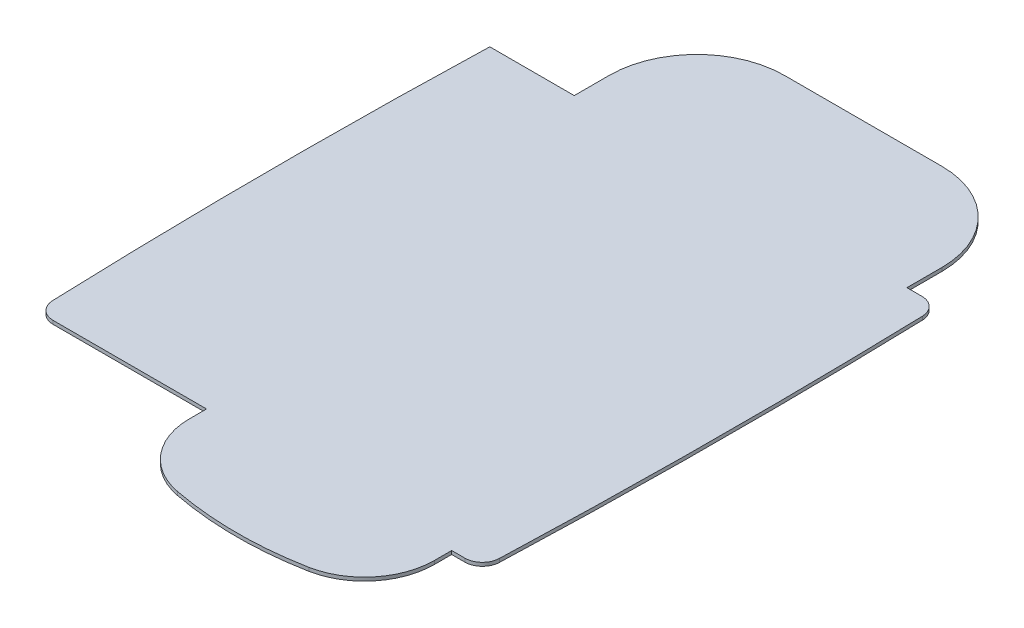
ISO-10303-21;
HEADER;
FILE_DESCRIPTION(('STEP AP214'),'2;1');
FILE_NAME('part.step','',(''),(''),'','','');
FILE_SCHEMA(('AUTOMOTIVE_DESIGN { 1 0 10303 214 1 1 1 1 }'));
ENDSEC;
DATA;
#1=APPLICATION_CONTEXT('core data for automotive mechanical design processes');
#2=APPLICATION_PROTOCOL_DEFINITION('international standard','automotive_design',2000,#1);
#3=PRODUCT_CONTEXT('',#1,'mechanical');
#4=PRODUCT('Part','Part','',(#3));
#5=PRODUCT_RELATED_PRODUCT_CATEGORY('part','',(#4));
#6=PRODUCT_DEFINITION_FORMATION('','',#4);
#7=PRODUCT_DEFINITION_CONTEXT('part definition',#1,'design');
#8=PRODUCT_DEFINITION('design','',#6,#7);
#9=PRODUCT_DEFINITION_SHAPE('','',#8);
#10=(LENGTH_UNIT() NAMED_UNIT(*) SI_UNIT(.MILLI.,.METRE.));
#11=(NAMED_UNIT(*) PLANE_ANGLE_UNIT() SI_UNIT($,.RADIAN.));
#12=(NAMED_UNIT(*) SI_UNIT($,.STERADIAN.) SOLID_ANGLE_UNIT());
#13=UNCERTAINTY_MEASURE_WITH_UNIT(LENGTH_MEASURE(1.E-05),#10,'distance_accuracy_value','');
#14=(GEOMETRIC_REPRESENTATION_CONTEXT(3) GLOBAL_UNCERTAINTY_ASSIGNED_CONTEXT((#13)) GLOBAL_UNIT_ASSIGNED_CONTEXT((#10,
#11,#12)) REPRESENTATION_CONTEXT('',''));
#15=CARTESIAN_POINT('',(0.,0.,0.));
#16=DIRECTION('',(0.,0.,1.));
#17=DIRECTION('',(1.,0.,0.));
#18=AXIS2_PLACEMENT_3D('',#15,#16,#17);
#19=CARTESIAN_POINT('',(0.,0.5,-92.5));
#20=DIRECTION('',(0.,0.,-1.));
#21=DIRECTION('',(-1.,0.,0.));
#22=AXIS2_PLACEMENT_3D('',#19,#20,#21);
#23=PLANE('',#22);
#24=DIRECTION('',(1.,0.,0.));
#25=VECTOR('',#24,1.);
#26=CARTESIAN_POINT('',(0.,-0.5,-92.5));
#27=LINE('',#26,#25);
#28=CARTESIAN_POINT('',(-15.,-0.5,-92.5));
#29=VERTEX_POINT('',#28);
#30=CARTESIAN_POINT('',(30.,-0.5,-92.5));
#31=VERTEX_POINT('',#30);
#32=EDGE_CURVE('E196',#29,#31,#27,.T.);
#33=ORIENTED_EDGE('',*,*,#32,.F.);
#34=DIRECTION('',(0.,1.,0.));
#35=VECTOR('',#34,1.);
#36=CARTESIAN_POINT('',(-15.,-0.5,-92.5));
#37=LINE('',#36,#35);
#38=CARTESIAN_POINT('',(-15.,0.5,-92.5));
#39=VERTEX_POINT('',#38);
#40=EDGE_CURVE('E179',#29,#39,#37,.T.);
#41=ORIENTED_EDGE('',*,*,#40,.T.);
#42=DIRECTION('',(1.,0.,0.));
#43=VECTOR('',#42,1.);
#44=CARTESIAN_POINT('',(0.,0.5,-92.5));
#45=LINE('',#44,#43);
#46=CARTESIAN_POINT('',(30.,0.5,-92.5));
#47=VERTEX_POINT('',#46);
#48=EDGE_CURVE('E331',#39,#47,#45,.T.);
#49=ORIENTED_EDGE('',*,*,#48,.T.);
#50=DIRECTION('',(0.,1.,0.));
#51=VECTOR('',#50,1.);
#52=CARTESIAN_POINT('',(30.,-0.5,-92.5));
#53=LINE('',#52,#51);
#54=EDGE_CURVE('E201',#31,#47,#53,.T.);
#55=ORIENTED_EDGE('',*,*,#54,.F.);
#56=EDGE_LOOP('',(#33,#41,#49,#55));
#57=FACE_BOUND('',#56,.T.);
#58=ADVANCED_FACE('F48',(#57),#23,.T.);
#59=CARTESIAN_POINT('',(0.,0.5,0.));
#60=DIRECTION('',(0.,1.,0.));
#61=DIRECTION('',(0.,0.,1.));
#62=AXIS2_PLACEMENT_3D('',#59,#60,#61);
#63=PLANE('',#62);
#64=DIRECTION('',(0.,0.,-1.));
#65=VECTOR('',#64,1.);
#66=CARTESIAN_POINT('',(-15.,0.5,72.5));
#67=LINE('',#66,#65);
#68=CARTESIAN_POINT('',(-15.,0.5,77.4061982515326));
#69=VERTEX_POINT('',#68);
#70=CARTESIAN_POINT('',(-15.,0.5,72.5));
#71=VERTEX_POINT('',#70);
#72=EDGE_CURVE('E281',#69,#71,#67,.T.);
#73=ORIENTED_EDGE('',*,*,#72,.F.);
#74=CARTESIAN_POINT('',(5.00000000000002,0.5,77.4061982515326));
#75=DIRECTION('',(0.,1.,0.));
#76=DIRECTION('',(0.,0.,1.));
#77=AXIS2_PLACEMENT_3D('',#74,#75,#76);
#78=CIRCLE('',#77,20.);
#79=CARTESIAN_POINT('',(1.25000000000002,0.5,97.0514903084097));
#80=VERTEX_POINT('',#79);
#81=EDGE_CURVE('E249',#69,#80,#78,.T.);
#82=ORIENTED_EDGE('',*,*,#81,.T.);
#83=CARTESIAN_POINT('',(20.,0.5,-1.17496997597598));
#84=DIRECTION('',(0.,1.,0.));
#85=DIRECTION('',(0.,0.,1.));
#86=AXIS2_PLACEMENT_3D('',#83,#84,#85);
#87=CIRCLE('',#86,100.);
#88=CARTESIAN_POINT('',(38.75,0.5,97.0514903084097));
#89=VERTEX_POINT('',#88);
#90=EDGE_CURVE('E279',#80,#89,#87,.T.);
#91=ORIENTED_EDGE('',*,*,#90,.T.);
#92=CARTESIAN_POINT('',(35.,0.5,77.4061982515326));
#93=DIRECTION('',(0.,1.,0.));
#94=DIRECTION('',(0.,0.,1.));
#95=AXIS2_PLACEMENT_3D('',#92,#93,#94);
#96=CIRCLE('',#95,20.);
#97=CARTESIAN_POINT('',(55.,0.5,77.4061982515326));
#98=VERTEX_POINT('',#97);
#99=EDGE_CURVE('E247',#89,#98,#96,.T.);
#100=ORIENTED_EDGE('',*,*,#99,.T.);
#101=DIRECTION('',(0.,0.,1.));
#102=VECTOR('',#101,1.);
#103=CARTESIAN_POINT('',(55.,0.5,72.5));
#104=LINE('',#103,#102);
#105=CARTESIAN_POINT('',(55.,0.5,72.5));
#106=VERTEX_POINT('',#105);
#107=EDGE_CURVE('E285',#106,#98,#104,.T.);
#108=ORIENTED_EDGE('',*,*,#107,.F.);
#109=DIRECTION('',(-1.,0.,0.));
#110=VECTOR('',#109,1.);
#111=CARTESIAN_POINT('',(55.,0.5,72.5));
#112=LINE('',#111,#110);
#113=CARTESIAN_POINT('',(58.7764057886327,0.5,72.5));
#114=VERTEX_POINT('',#113);
#115=EDGE_CURVE('E287',#114,#106,#112,.T.);
#116=ORIENTED_EDGE('',*,*,#115,.F.);
#117=CARTESIAN_POINT('',(58.7764057886327,0.5,67.5));
#118=DIRECTION('',(0.,1.,0.));
#119=DIRECTION('',(0.,0.,1.));
#120=AXIS2_PLACEMENT_3D('',#117,#118,#119);
#121=CIRCLE('',#120,5.);
#122=CARTESIAN_POINT('',(63.7730594606828,0.5,67.6828991022093));
#123=VERTEX_POINT('',#122);
#124=EDGE_CURVE('E222',#114,#123,#121,.T.);
#125=ORIENTED_EDGE('',*,*,#124,.T.);
#126=CARTESIAN_POINT('',(0.,0.5,0.));
#127=DIRECTION('',(0.,1.,0.));
#128=DIRECTION('',(0.,0.,1.));
#129=AXIS2_PLACEMENT_3D('',#126,#127,#128);
#130=ELLIPSE('',#129,350.,65.);
#131=CARTESIAN_POINT('',(64.2606055592189,0.5,-52.6412109634021));
#132=VERTEX_POINT('',#131);
#133=EDGE_CURVE('E206',#123,#132,#130,.T.);
#134=ORIENTED_EDGE('',*,*,#133,.T.);
#135=CARTESIAN_POINT('',(59.262600010621,0.5,-52.5));
#136=DIRECTION('',(0.,1.,0.));
#137=DIRECTION('',(0.,0.,1.));
#138=AXIS2_PLACEMENT_3D('',#135,#136,#137);
#139=CIRCLE('',#138,5.);
#140=CARTESIAN_POINT('',(59.262600010621,0.5,-57.5));
#141=VERTEX_POINT('',#140);
#142=EDGE_CURVE('E220',#132,#141,#139,.T.);
#143=ORIENTED_EDGE('',*,*,#142,.T.);
#144=DIRECTION('',(1.,0.,0.));
#145=VECTOR('',#144,1.);
#146=CARTESIAN_POINT('',(55.,0.5,-57.5));
#147=LINE('',#146,#145);
#148=CARTESIAN_POINT('',(55.,0.5,-57.5));
#149=VERTEX_POINT('',#148);
#150=EDGE_CURVE('E309',#149,#141,#147,.T.);
#151=ORIENTED_EDGE('',*,*,#150,.F.);
#152=DIRECTION('',(0.,0.,1.));
#153=VECTOR('',#152,1.);
#154=CARTESIAN_POINT('',(55.,0.5,-92.5));
#155=LINE('',#154,#153);
#156=CARTESIAN_POINT('',(55.,0.5,-67.5));
#157=VERTEX_POINT('',#156);
#158=EDGE_CURVE('E305',#157,#149,#155,.T.);
#159=ORIENTED_EDGE('',*,*,#158,.F.);
#160=CARTESIAN_POINT('',(30.,0.5,-67.5));
#161=DIRECTION('',(0.,1.,0.));
#162=DIRECTION('',(0.,0.,1.));
#163=AXIS2_PLACEMENT_3D('',#160,#161,#162);
#164=CIRCLE('',#163,25.);
#165=EDGE_CURVE('E389',#157,#47,#164,.T.);
#166=ORIENTED_EDGE('',*,*,#165,.T.);
#167=ORIENTED_EDGE('',*,*,#48,.F.);
#168=CARTESIAN_POINT('',(-15.,0.5,-67.5));
#169=DIRECTION('',(0.,1.,0.));
#170=DIRECTION('',(0.,0.,1.));
#171=AXIS2_PLACEMENT_3D('',#168,#169,#170);
#172=CIRCLE('',#171,25.);
#173=CARTESIAN_POINT('',(-40.,0.5,-67.5));
#174=VERTEX_POINT('',#173);
#175=EDGE_CURVE('E185',#39,#174,#172,.T.);
#176=ORIENTED_EDGE('',*,*,#175,.T.);
#177=DIRECTION('',(0.,0.,-1.));
#178=VECTOR('',#177,1.);
#179=CARTESIAN_POINT('',(-40.,0.5,-92.5));
#180=LINE('',#179,#178);
#181=CARTESIAN_POINT('',(-40.,0.5,-57.5));
#182=VERTEX_POINT('',#181);
#183=EDGE_CURVE('E321',#182,#174,#180,.T.);
#184=ORIENTED_EDGE('',*,*,#183,.F.);
#185=DIRECTION('',(1.,0.,0.));
#186=VECTOR('',#185,1.);
#187=CARTESIAN_POINT('',(-65.,0.5,-57.5));
#188=LINE('',#187,#186);
#189=CARTESIAN_POINT('',(-64.1168317389818,0.5,-57.5));
#190=VERTEX_POINT('',#189);
#191=EDGE_CURVE('E318',#190,#182,#188,.T.);
#192=ORIENTED_EDGE('',*,*,#191,.F.);
#193=CARTESIAN_POINT('',(-63.7730594606828,0.5,67.6828991022094));
#194=VERTEX_POINT('',#193);
#195=EDGE_CURVE('E215',#190,#194,#130,.T.);
#196=ORIENTED_EDGE('',*,*,#195,.T.);
#197=CARTESIAN_POINT('',(-58.7764057886327,0.5,67.5000000000001));
#198=DIRECTION('',(0.,1.,0.));
#199=DIRECTION('',(0.,0.,1.));
#200=AXIS2_PLACEMENT_3D('',#197,#198,#199);
#201=CIRCLE('',#200,5.);
#202=CARTESIAN_POINT('',(-58.7764057886327,0.5,72.5));
#203=VERTEX_POINT('',#202);
#204=EDGE_CURVE('E224',#194,#203,#201,.T.);
#205=ORIENTED_EDGE('',*,*,#204,.T.);
#206=DIRECTION('',(-1.,0.,0.));
#207=VECTOR('',#206,1.);
#208=CARTESIAN_POINT('',(-65.,0.5,72.5));
#209=LINE('',#208,#207);
#210=EDGE_CURVE('E272',#71,#203,#209,.T.);
#211=ORIENTED_EDGE('',*,*,#210,.F.);
#212=EDGE_LOOP('',(#73,#82,#91,#100,#108,#116,#125,#134,#143,#151,#159,#166,#167,#176,#184,#192,
#196,#205,#211));
#213=FACE_BOUND('',#212,.T.);
#214=ADVANCED_FACE('F278',(#213),#63,.T.);
#215=CARTESIAN_POINT('',(0.,-0.5,0.));
#216=DIRECTION('',(0.,1.,0.));
#217=DIRECTION('',(0.,0.,1.));
#218=AXIS2_PLACEMENT_3D('',#215,#216,#217);
#219=PLANE('',#218);
#220=CARTESIAN_POINT('',(20.,-0.5,-1.17496997597598));
#221=DIRECTION('',(0.,1.,0.));
#222=DIRECTION('',(0.,0.,1.));
#223=AXIS2_PLACEMENT_3D('',#220,#221,#222);
#224=CIRCLE('',#223,100.);
#225=CARTESIAN_POINT('',(1.25000000000002,-0.5,97.0514903084097));
#226=VERTEX_POINT('',#225);
#227=CARTESIAN_POINT('',(38.75,-0.5,97.0514903084097));
#228=VERTEX_POINT('',#227);
#229=EDGE_CURVE('E261',#226,#228,#224,.T.);
#230=ORIENTED_EDGE('',*,*,#229,.F.);
#231=CARTESIAN_POINT('',(5.00000000000002,-0.5,77.4061982515326));
#232=DIRECTION('',(0.,1.,0.));
#233=DIRECTION('',(0.,0.,1.));
#234=AXIS2_PLACEMENT_3D('',#231,#232,#233);
#235=CIRCLE('',#234,20.);
#236=CARTESIAN_POINT('',(-15.,-0.5,77.4061982515326));
#237=VERTEX_POINT('',#236);
#238=EDGE_CURVE('E56',#226,#237,#235,.F.);
#239=ORIENTED_EDGE('',*,*,#238,.T.);
#240=DIRECTION('',(0.,0.,-1.));
#241=VECTOR('',#240,1.);
#242=CARTESIAN_POINT('',(-15.,-0.5,72.5));
#243=LINE('',#242,#241);
#244=CARTESIAN_POINT('',(-15.,-0.5,72.5));
#245=VERTEX_POINT('',#244);
#246=EDGE_CURVE('E259',#237,#245,#243,.T.);
#247=ORIENTED_EDGE('',*,*,#246,.T.);
#248=DIRECTION('',(-1.,0.,0.));
#249=VECTOR('',#248,1.);
#250=CARTESIAN_POINT('',(-65.,-0.5,72.5));
#251=LINE('',#250,#249);
#252=CARTESIAN_POINT('',(-58.7764057886327,-0.5,72.5));
#253=VERTEX_POINT('',#252);
#254=EDGE_CURVE('E271',#245,#253,#251,.T.);
#255=ORIENTED_EDGE('',*,*,#254,.T.);
#256=CARTESIAN_POINT('',(-58.7764057886327,-0.5,67.5000000000001));
#257=DIRECTION('',(0.,1.,0.));
#258=DIRECTION('',(0.,0.,1.));
#259=AXIS2_PLACEMENT_3D('',#256,#257,#258);
#260=CIRCLE('',#259,5.);
#261=CARTESIAN_POINT('',(-63.7730594606828,-0.5,67.6828991022094));
#262=VERTEX_POINT('',#261);
#263=EDGE_CURVE('E232',#253,#262,#260,.F.);
#264=ORIENTED_EDGE('',*,*,#263,.T.);
#265=CARTESIAN_POINT('',(0.,-0.5,0.));
#266=DIRECTION('',(0.,1.,0.));
#267=DIRECTION('',(0.,0.,1.));
#268=AXIS2_PLACEMENT_3D('',#265,#266,#267);
#269=ELLIPSE('',#268,350.,65.);
#270=CARTESIAN_POINT('',(-64.1168317389818,-0.5,-57.5));
#271=VERTEX_POINT('',#270);
#272=EDGE_CURVE('E202',#271,#262,#269,.T.);
#273=ORIENTED_EDGE('',*,*,#272,.F.);
#274=DIRECTION('',(1.,0.,0.));
#275=VECTOR('',#274,1.);
#276=CARTESIAN_POINT('',(0.,-0.5,-57.5));
#277=LINE('',#276,#275);
#278=CARTESIAN_POINT('',(-40.,-0.5,-57.5));
#279=VERTEX_POINT('',#278);
#280=EDGE_CURVE('E212',#271,#279,#277,.T.);
#281=ORIENTED_EDGE('',*,*,#280,.T.);
#282=DIRECTION('',(0.,0.,-1.));
#283=VECTOR('',#282,1.);
#284=CARTESIAN_POINT('',(-40.,-0.5,-92.5));
#285=LINE('',#284,#283);
#286=CARTESIAN_POINT('',(-40.,-0.5,-67.5));
#287=VERTEX_POINT('',#286);
#288=EDGE_CURVE('E198',#279,#287,#285,.T.);
#289=ORIENTED_EDGE('',*,*,#288,.T.);
#290=CARTESIAN_POINT('',(-15.,-0.5,-67.5));
#291=DIRECTION('',(0.,1.,0.));
#292=DIRECTION('',(0.,0.,1.));
#293=AXIS2_PLACEMENT_3D('',#290,#291,#292);
#294=CIRCLE('',#293,25.);
#295=EDGE_CURVE('E182',#29,#287,#294,.T.);
#296=ORIENTED_EDGE('',*,*,#295,.F.);
#297=ORIENTED_EDGE('',*,*,#32,.T.);
#298=CARTESIAN_POINT('',(30.,-0.5,-67.5));
#299=DIRECTION('',(0.,1.,0.));
#300=DIRECTION('',(0.,0.,1.));
#301=AXIS2_PLACEMENT_3D('',#298,#299,#300);
#302=CIRCLE('',#301,25.);
#303=CARTESIAN_POINT('',(55.,-0.5,-67.5));
#304=VERTEX_POINT('',#303);
#305=EDGE_CURVE('E391',#304,#31,#302,.T.);
#306=ORIENTED_EDGE('',*,*,#305,.F.);
#307=DIRECTION('',(0.,0.,1.));
#308=VECTOR('',#307,1.);
#309=CARTESIAN_POINT('',(55.,-0.5,-92.5));
#310=LINE('',#309,#308);
#311=CARTESIAN_POINT('',(55.,-0.5,-57.5));
#312=VERTEX_POINT('',#311);
#313=EDGE_CURVE('E306',#304,#312,#310,.T.);
#314=ORIENTED_EDGE('',*,*,#313,.T.);
#315=DIRECTION('',(1.,0.,0.));
#316=VECTOR('',#315,1.);
#317=CARTESIAN_POINT('',(55.,-0.5,-57.5));
#318=LINE('',#317,#316);
#319=CARTESIAN_POINT('',(59.262600010621,-0.5,-57.5));
#320=VERTEX_POINT('',#319);
#321=EDGE_CURVE('E308',#312,#320,#318,.T.);
#322=ORIENTED_EDGE('',*,*,#321,.T.);
#323=CARTESIAN_POINT('',(59.262600010621,-0.5,-52.5));
#324=DIRECTION('',(0.,1.,0.));
#325=DIRECTION('',(0.,0.,1.));
#326=AXIS2_PLACEMENT_3D('',#323,#324,#325);
#327=CIRCLE('',#326,5.);
#328=CARTESIAN_POINT('',(64.2606055592189,-0.5,-52.6412109634021));
#329=VERTEX_POINT('',#328);
#330=EDGE_CURVE('E228',#320,#329,#327,.F.);
#331=ORIENTED_EDGE('',*,*,#330,.T.);
#332=CARTESIAN_POINT('',(63.7730594606828,-0.5,67.6828991022093));
#333=VERTEX_POINT('',#332);
#334=EDGE_CURVE('E203',#333,#329,#269,.T.);
#335=ORIENTED_EDGE('',*,*,#334,.F.);
#336=CARTESIAN_POINT('',(58.7764057886327,-0.5,67.5));
#337=DIRECTION('',(0.,1.,0.));
#338=DIRECTION('',(0.,0.,1.));
#339=AXIS2_PLACEMENT_3D('',#336,#337,#338);
#340=CIRCLE('',#339,5.);
#341=CARTESIAN_POINT('',(58.7764057886327,-0.5,72.5));
#342=VERTEX_POINT('',#341);
#343=EDGE_CURVE('E230',#333,#342,#340,.F.);
#344=ORIENTED_EDGE('',*,*,#343,.T.);
#345=DIRECTION('',(-1.,0.,0.));
#346=VECTOR('',#345,1.);
#347=CARTESIAN_POINT('',(0.,-0.5,72.5));
#348=LINE('',#347,#346);
#349=CARTESIAN_POINT('',(55.,-0.5,72.5));
#350=VERTEX_POINT('',#349);
#351=EDGE_CURVE('E214',#342,#350,#348,.T.);
#352=ORIENTED_EDGE('',*,*,#351,.T.);
#353=DIRECTION('',(0.,0.,1.));
#354=VECTOR('',#353,1.);
#355=CARTESIAN_POINT('',(55.,-0.5,72.5));
#356=LINE('',#355,#354);
#357=CARTESIAN_POINT('',(55.,-0.5,77.4061982515326));
#358=VERTEX_POINT('',#357);
#359=EDGE_CURVE('E294',#350,#358,#356,.T.);
#360=ORIENTED_EDGE('',*,*,#359,.T.);
#361=CARTESIAN_POINT('',(35.,-0.5,77.4061982515326));
#362=DIRECTION('',(0.,1.,0.));
#363=DIRECTION('',(0.,0.,1.));
#364=AXIS2_PLACEMENT_3D('',#361,#362,#363);
#365=CIRCLE('',#364,20.);
#366=EDGE_CURVE('E68',#358,#228,#365,.F.);
#367=ORIENTED_EDGE('',*,*,#366,.T.);
#368=EDGE_LOOP('',(#230,#239,#247,#255,#264,#273,#281,#289,#296,#297,#306,#314,#322,#331,#335,
#344,#352,#360,#367));
#369=FACE_BOUND('',#368,.T.);
#370=ADVANCED_FACE('F194',(#369),#219,.F.);
#371=CARTESIAN_POINT('',(-40.,-0.5,-92.5));
#372=DIRECTION('',(1.,0.,0.));
#373=DIRECTION('',(0.,0.,-1.));
#374=AXIS2_PLACEMENT_3D('',#371,#372,#373);
#375=PLANE('',#374);
#376=DIRECTION('',(0.,1.,0.));
#377=VECTOR('',#376,1.);
#378=CARTESIAN_POINT('',(-40.,-0.5,-67.5));
#379=LINE('',#378,#377);
#380=EDGE_CURVE('E190',#287,#174,#379,.T.);
#381=ORIENTED_EDGE('',*,*,#380,.F.);
#382=ORIENTED_EDGE('',*,*,#288,.F.);
#383=DIRECTION('',(0.,1.,0.));
#384=VECTOR('',#383,1.);
#385=CARTESIAN_POINT('',(-40.,-0.5,-57.5));
#386=LINE('',#385,#384);
#387=EDGE_CURVE('E320',#279,#182,#386,.T.);
#388=ORIENTED_EDGE('',*,*,#387,.T.);
#389=ORIENTED_EDGE('',*,*,#183,.T.);
#390=EDGE_LOOP('',(#381,#382,#388,#389));
#391=FACE_BOUND('',#390,.T.);
#392=ADVANCED_FACE('F406',(#391),#375,.F.);
#393=DIRECTION('',(0.,-1.,0.));
#394=VECTOR('',#393,1.);
#395=SURFACE_OF_LINEAR_EXTRUSION('',#130,#394);
#396=ORIENTED_EDGE('',*,*,#133,.F.);
#397=DIRECTION('',(0.,-1.,0.));
#398=VECTOR('',#397,1.);
#399=CARTESIAN_POINT('',(63.7730594606828,0.5,67.6828991022093));
#400=LINE('',#399,#398);
#401=EDGE_CURVE('E237',#123,#333,#400,.T.);
#402=ORIENTED_EDGE('',*,*,#401,.T.);
#403=ORIENTED_EDGE('',*,*,#334,.T.);
#404=DIRECTION('',(0.,-1.,0.));
#405=VECTOR('',#404,1.);
#406=CARTESIAN_POINT('',(64.2606055592189,-0.5,-52.6412109634021));
#407=LINE('',#406,#405);
#408=EDGE_CURVE('E234',#329,#132,#407,.F.);
#409=ORIENTED_EDGE('',*,*,#408,.T.);
#410=EDGE_LOOP('',(#396,#402,#403,#409));
#411=FACE_BOUND('',#410,.T.);
#412=ADVANCED_FACE('F338',(#411),#395,.F.);
#413=ORIENTED_EDGE('',*,*,#272,.T.);
#414=DIRECTION('',(0.,-1.,0.));
#415=VECTOR('',#414,1.);
#416=CARTESIAN_POINT('',(-63.7730594606828,-0.5,67.6828991022094));
#417=LINE('',#416,#415);
#418=EDGE_CURVE('E217',#262,#194,#417,.F.);
#419=ORIENTED_EDGE('',*,*,#418,.T.);
#420=ORIENTED_EDGE('',*,*,#195,.F.);
#421=DIRECTION('',(0.,-1.,0.));
#422=VECTOR('',#421,1.);
#423=CARTESIAN_POINT('',(-64.1168317389817,0.5,-57.5));
#424=LINE('',#423,#422);
#425=EDGE_CURVE('E209',#190,#271,#424,.T.);
#426=ORIENTED_EDGE('',*,*,#425,.T.);
#427=EDGE_LOOP('',(#413,#419,#420,#426));
#428=FACE_BOUND('',#427,.T.);
#429=ADVANCED_FACE('F333',(#428),#395,.F.);
#430=CARTESIAN_POINT('',(-65.,-0.5,-57.5));
#431=DIRECTION('',(0.,0.,1.));
#432=DIRECTION('',(1.,0.,0.));
#433=AXIS2_PLACEMENT_3D('',#430,#431,#432);
#434=PLANE('',#433);
#435=ORIENTED_EDGE('',*,*,#191,.T.);
#436=ORIENTED_EDGE('',*,*,#387,.F.);
#437=ORIENTED_EDGE('',*,*,#280,.F.);
#438=ORIENTED_EDGE('',*,*,#425,.F.);
#439=EDGE_LOOP('',(#435,#436,#437,#438));
#440=FACE_BOUND('',#439,.T.);
#441=ADVANCED_FACE('F337',(#440),#434,.F.);
#442=CARTESIAN_POINT('',(55.,-0.5,-57.5));
#443=DIRECTION('',(0.,0.,1.));
#444=DIRECTION('',(1.,0.,0.));
#445=AXIS2_PLACEMENT_3D('',#442,#443,#444);
#446=PLANE('',#445);
#447=ORIENTED_EDGE('',*,*,#150,.T.);
#448=DIRECTION('',(0.,-1.,0.));
#449=VECTOR('',#448,1.);
#450=CARTESIAN_POINT('',(59.262600010621,-0.5,-57.5));
#451=LINE('',#450,#449);
#452=EDGE_CURVE('E242',#141,#320,#451,.T.);
#453=ORIENTED_EDGE('',*,*,#452,.T.);
#454=ORIENTED_EDGE('',*,*,#321,.F.);
#455=DIRECTION('',(0.,1.,0.));
#456=VECTOR('',#455,1.);
#457=CARTESIAN_POINT('',(55.,-0.5,-57.5));
#458=LINE('',#457,#456);
#459=EDGE_CURVE('E312',#312,#149,#458,.T.);
#460=ORIENTED_EDGE('',*,*,#459,.T.);
#461=EDGE_LOOP('',(#447,#453,#454,#460));
#462=FACE_BOUND('',#461,.T.);
#463=ADVANCED_FACE('F382',(#462),#446,.F.);
#464=CARTESIAN_POINT('',(55.,-0.5,-92.5));
#465=DIRECTION('',(-1.,0.,0.));
#466=DIRECTION('',(0.,0.,1.));
#467=AXIS2_PLACEMENT_3D('',#464,#465,#466);
#468=PLANE('',#467);
#469=ORIENTED_EDGE('',*,*,#313,.F.);
#470=DIRECTION('',(0.,1.,0.));
#471=VECTOR('',#470,1.);
#472=CARTESIAN_POINT('',(55.,-0.5,-67.5));
#473=LINE('',#472,#471);
#474=EDGE_CURVE('E291',#304,#157,#473,.T.);
#475=ORIENTED_EDGE('',*,*,#474,.T.);
#476=ORIENTED_EDGE('',*,*,#158,.T.);
#477=ORIENTED_EDGE('',*,*,#459,.F.);
#478=EDGE_LOOP('',(#469,#475,#476,#477));
#479=FACE_BOUND('',#478,.T.);
#480=ADVANCED_FACE('F386',(#479),#468,.F.);
#481=CARTESIAN_POINT('',(-65.,-0.5,72.5));
#482=DIRECTION('',(0.,0.,-1.));
#483=DIRECTION('',(-1.,0.,0.));
#484=AXIS2_PLACEMENT_3D('',#481,#482,#483);
#485=PLANE('',#484);
#486=ORIENTED_EDGE('',*,*,#210,.T.);
#487=DIRECTION('',(0.,-1.,0.));
#488=VECTOR('',#487,1.);
#489=CARTESIAN_POINT('',(-58.7764057886327,-0.5,72.5));
#490=LINE('',#489,#488);
#491=EDGE_CURVE('E226',#203,#253,#490,.T.);
#492=ORIENTED_EDGE('',*,*,#491,.T.);
#493=ORIENTED_EDGE('',*,*,#254,.F.);
#494=DIRECTION('',(0.,1.,0.));
#495=VECTOR('',#494,1.);
#496=CARTESIAN_POINT('',(-15.,-0.5,72.5));
#497=LINE('',#496,#495);
#498=EDGE_CURVE('E270',#245,#71,#497,.T.);
#499=ORIENTED_EDGE('',*,*,#498,.T.);
#500=EDGE_LOOP('',(#486,#492,#493,#499));
#501=FACE_BOUND('',#500,.T.);
#502=ADVANCED_FACE('F402',(#501),#485,.F.);
#503=CARTESIAN_POINT('',(-15.,-0.5,72.5));
#504=DIRECTION('',(1.,0.,0.));
#505=DIRECTION('',(0.,0.,-1.));
#506=AXIS2_PLACEMENT_3D('',#503,#504,#505);
#507=PLANE('',#506);
#508=ORIENTED_EDGE('',*,*,#246,.F.);
#509=DIRECTION('',(0.,-1.,0.));
#510=VECTOR('',#509,1.);
#511=CARTESIAN_POINT('',(-15.,-0.5,77.4061982515326));
#512=LINE('',#511,#510);
#513=EDGE_CURVE('E244',#237,#69,#512,.F.);
#514=ORIENTED_EDGE('',*,*,#513,.T.);
#515=ORIENTED_EDGE('',*,*,#72,.T.);
#516=ORIENTED_EDGE('',*,*,#498,.F.);
#517=EDGE_LOOP('',(#508,#514,#515,#516));
#518=FACE_BOUND('',#517,.T.);
#519=ADVANCED_FACE('F267',(#518),#507,.F.);
#520=CARTESIAN_POINT('',(55.,-0.5,72.5));
#521=DIRECTION('',(0.,0.,-1.));
#522=DIRECTION('',(-1.,0.,0.));
#523=AXIS2_PLACEMENT_3D('',#520,#521,#522);
#524=PLANE('',#523);
#525=ORIENTED_EDGE('',*,*,#351,.F.);
#526=DIRECTION('',(0.,-1.,0.));
#527=VECTOR('',#526,1.);
#528=CARTESIAN_POINT('',(58.7764057886327,-0.5,72.5));
#529=LINE('',#528,#527);
#530=EDGE_CURVE('E240',#342,#114,#529,.F.);
#531=ORIENTED_EDGE('',*,*,#530,.T.);
#532=ORIENTED_EDGE('',*,*,#115,.T.);
#533=DIRECTION('',(0.,1.,0.));
#534=VECTOR('',#533,1.);
#535=CARTESIAN_POINT('',(55.,-0.5,72.5));
#536=LINE('',#535,#534);
#537=EDGE_CURVE('E295',#350,#106,#536,.T.);
#538=ORIENTED_EDGE('',*,*,#537,.F.);
#539=EDGE_LOOP('',(#525,#531,#532,#538));
#540=FACE_BOUND('',#539,.T.);
#541=ADVANCED_FACE('F368',(#540),#524,.F.);
#542=CARTESIAN_POINT('',(55.,-0.5,72.5));
#543=DIRECTION('',(-1.,0.,0.));
#544=DIRECTION('',(0.,0.,1.));
#545=AXIS2_PLACEMENT_3D('',#542,#543,#544);
#546=PLANE('',#545);
#547=ORIENTED_EDGE('',*,*,#107,.T.);
#548=DIRECTION('',(0.,-1.,0.));
#549=VECTOR('',#548,1.);
#550=CARTESIAN_POINT('',(55.,-0.5,77.4061982515326));
#551=LINE('',#550,#549);
#552=EDGE_CURVE('E11',#98,#358,#551,.T.);
#553=ORIENTED_EDGE('',*,*,#552,.T.);
#554=ORIENTED_EDGE('',*,*,#359,.F.);
#555=ORIENTED_EDGE('',*,*,#537,.T.);
#556=EDGE_LOOP('',(#547,#553,#554,#555));
#557=FACE_BOUND('',#556,.T.);
#558=ADVANCED_FACE('F364',(#557),#546,.F.);
#559=CARTESIAN_POINT('',(20.,0.5,-1.17496997597598));
#560=DIRECTION('',(0.,-1.,0.));
#561=DIRECTION('',(0.,0.,-1.));
#562=AXIS2_PLACEMENT_3D('',#559,#560,#561);
#563=CYLINDRICAL_SURFACE('',#562,100.);
#564=ORIENTED_EDGE('',*,*,#90,.F.);
#565=DIRECTION('',(0.,-1.,0.));
#566=VECTOR('',#565,1.);
#567=CARTESIAN_POINT('',(1.25000000000002,0.5,97.0514903084097));
#568=LINE('',#567,#566);
#569=EDGE_CURVE('E254',#80,#226,#568,.T.);
#570=ORIENTED_EDGE('',*,*,#569,.T.);
#571=ORIENTED_EDGE('',*,*,#229,.T.);
#572=DIRECTION('',(0.,-1.,0.));
#573=VECTOR('',#572,1.);
#574=CARTESIAN_POINT('',(38.75,0.5,97.0514903084097));
#575=LINE('',#574,#573);
#576=EDGE_CURVE('E251',#228,#89,#575,.F.);
#577=ORIENTED_EDGE('',*,*,#576,.T.);
#578=EDGE_LOOP('',(#564,#570,#571,#577));
#579=FACE_BOUND('',#578,.T.);
#580=ADVANCED_FACE('F283',(#579),#563,.T.);
#581=CARTESIAN_POINT('',(30.,-0.5,-67.5));
#582=DIRECTION('',(0.,1.,0.));
#583=DIRECTION('',(0.,0.,1.));
#584=AXIS2_PLACEMENT_3D('',#581,#582,#583);
#585=CYLINDRICAL_SURFACE('',#584,25.);
#586=ORIENTED_EDGE('',*,*,#165,.F.);
#587=ORIENTED_EDGE('',*,*,#474,.F.);
#588=ORIENTED_EDGE('',*,*,#305,.T.);
#589=ORIENTED_EDGE('',*,*,#54,.T.);
#590=EDGE_LOOP('',(#586,#587,#588,#589));
#591=FACE_BOUND('',#590,.T.);
#592=ADVANCED_FACE('F410',(#591),#585,.T.);
#593=CARTESIAN_POINT('',(-15.,-0.5,-67.5));
#594=DIRECTION('',(0.,1.,0.));
#595=DIRECTION('',(0.,0.,1.));
#596=AXIS2_PLACEMENT_3D('',#593,#594,#595);
#597=CYLINDRICAL_SURFACE('',#596,25.);
#598=ORIENTED_EDGE('',*,*,#175,.F.);
#599=ORIENTED_EDGE('',*,*,#40,.F.);
#600=ORIENTED_EDGE('',*,*,#295,.T.);
#601=ORIENTED_EDGE('',*,*,#380,.T.);
#602=EDGE_LOOP('',(#598,#599,#600,#601));
#603=FACE_BOUND('',#602,.T.);
#604=ADVANCED_FACE('F181',(#603),#597,.T.);
#605=CARTESIAN_POINT('',(-58.7764057886327,0.,67.5000000000001));
#606=DIRECTION('',(0.,-1.,0.));
#607=DIRECTION('',(0.,0.,-1.));
#608=AXIS2_PLACEMENT_3D('',#605,#606,#607);
#609=CYLINDRICAL_SURFACE('',#608,5.);
#610=ORIENTED_EDGE('',*,*,#263,.F.);
#611=ORIENTED_EDGE('',*,*,#491,.F.);
#612=ORIENTED_EDGE('',*,*,#204,.F.);
#613=ORIENTED_EDGE('',*,*,#418,.F.);
#614=EDGE_LOOP('',(#610,#611,#612,#613));
#615=FACE_BOUND('',#614,.T.);
#616=ADVANCED_FACE('F343',(#615),#609,.T.);
#617=CARTESIAN_POINT('',(58.7764057886327,0.,67.5));
#618=DIRECTION('',(0.,-1.,0.));
#619=DIRECTION('',(0.,0.,-1.));
#620=AXIS2_PLACEMENT_3D('',#617,#618,#619);
#621=CYLINDRICAL_SURFACE('',#620,5.);
#622=ORIENTED_EDGE('',*,*,#124,.F.);
#623=ORIENTED_EDGE('',*,*,#530,.F.);
#624=ORIENTED_EDGE('',*,*,#343,.F.);
#625=ORIENTED_EDGE('',*,*,#401,.F.);
#626=EDGE_LOOP('',(#622,#623,#624,#625));
#627=FACE_BOUND('',#626,.T.);
#628=ADVANCED_FACE('F346',(#627),#621,.T.);
#629=CARTESIAN_POINT('',(59.262600010621,0.,-52.5));
#630=DIRECTION('',(0.,-1.,0.));
#631=DIRECTION('',(0.,0.,-1.));
#632=AXIS2_PLACEMENT_3D('',#629,#630,#631);
#633=CYLINDRICAL_SURFACE('',#632,5.);
#634=ORIENTED_EDGE('',*,*,#330,.F.);
#635=ORIENTED_EDGE('',*,*,#452,.F.);
#636=ORIENTED_EDGE('',*,*,#142,.F.);
#637=ORIENTED_EDGE('',*,*,#408,.F.);
#638=EDGE_LOOP('',(#634,#635,#636,#637));
#639=FACE_BOUND('',#638,.T.);
#640=ADVANCED_FACE('F350',(#639),#633,.T.);
#641=CARTESIAN_POINT('',(5.00000000000002,0.5,77.4061982515326));
#642=DIRECTION('',(0.,-1.,0.));
#643=DIRECTION('',(0.,0.,-1.));
#644=AXIS2_PLACEMENT_3D('',#641,#642,#643);
#645=CYLINDRICAL_SURFACE('',#644,20.);
#646=ORIENTED_EDGE('',*,*,#238,.F.);
#647=ORIENTED_EDGE('',*,*,#569,.F.);
#648=ORIENTED_EDGE('',*,*,#81,.F.);
#649=ORIENTED_EDGE('',*,*,#513,.F.);
#650=EDGE_LOOP('',(#646,#647,#648,#649));
#651=FACE_BOUND('',#650,.T.);
#652=ADVANCED_FACE('F274',(#651),#645,.T.);
#653=CARTESIAN_POINT('',(35.,0.5,77.4061982515326));
#654=DIRECTION('',(0.,-1.,0.));
#655=DIRECTION('',(0.,0.,-1.));
#656=AXIS2_PLACEMENT_3D('',#653,#654,#655);
#657=CYLINDRICAL_SURFACE('',#656,20.);
#658=ORIENTED_EDGE('',*,*,#366,.F.);
#659=ORIENTED_EDGE('',*,*,#552,.F.);
#660=ORIENTED_EDGE('',*,*,#99,.F.);
#661=ORIENTED_EDGE('',*,*,#576,.F.);
#662=EDGE_LOOP('',(#658,#659,#660,#661));
#663=FACE_BOUND('',#662,.T.);
#664=ADVANCED_FACE('F50',(#663),#657,.T.);
#665=CLOSED_SHELL('',(#58,#214,#370,#392,#412,#429,#441,#463,#480,#502,#519,#541,#558,#580,#592,
#604,#616,#628,#640,#652,#664));
#666=MANIFOLD_SOLID_BREP('B2',#665);
#667=ADVANCED_BREP_SHAPE_REPRESENTATION('',(#18,#666),#14);
#668=SHAPE_DEFINITION_REPRESENTATION(#9,#667);
ENDSEC;
END-ISO-10303-21;
